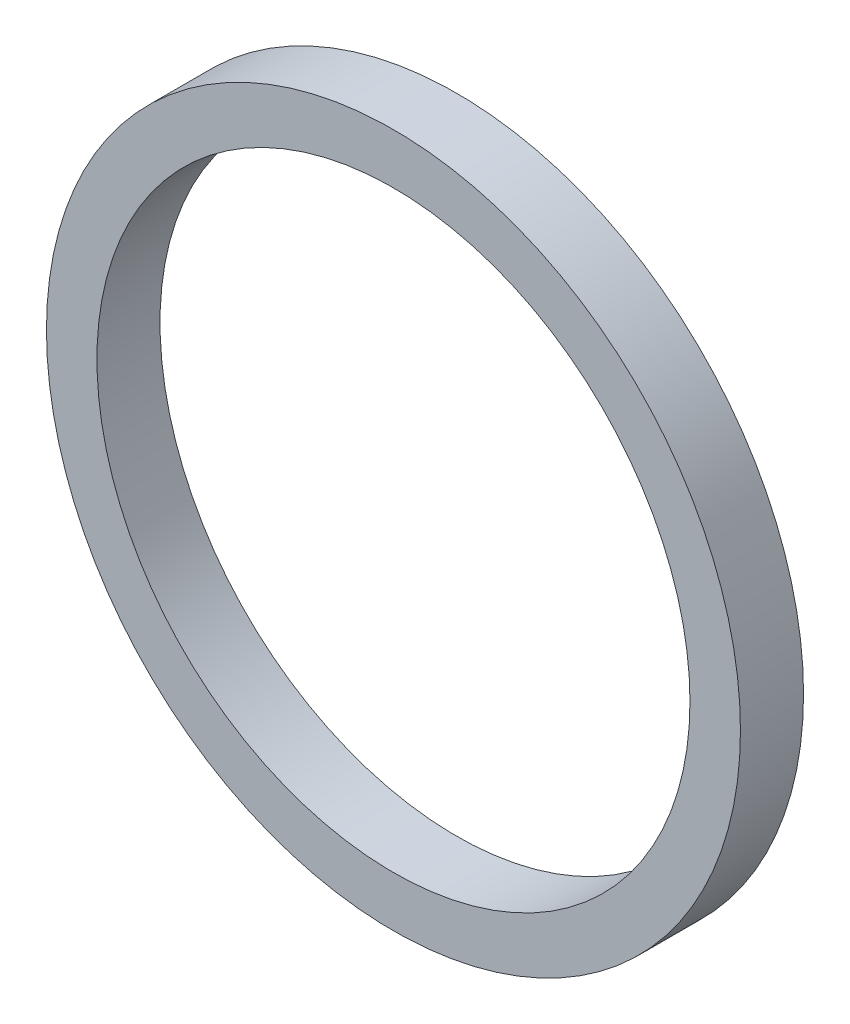
ISO-10303-21;
HEADER;
FILE_DESCRIPTION(('STEP AP214'),'2;1');
FILE_NAME('part.step','',(''),(''),'','','');
FILE_SCHEMA(('AUTOMOTIVE_DESIGN { 1 0 10303 214 1 1 1 1 }'));
ENDSEC;
DATA;
#1=APPLICATION_CONTEXT('core data for automotive mechanical design processes');
#2=APPLICATION_PROTOCOL_DEFINITION('international standard','automotive_design',2000,#1);
#3=PRODUCT_CONTEXT('',#1,'mechanical');
#4=PRODUCT('Part','Part','',(#3));
#5=PRODUCT_RELATED_PRODUCT_CATEGORY('part','',(#4));
#6=PRODUCT_DEFINITION_FORMATION('','',#4);
#7=PRODUCT_DEFINITION_CONTEXT('part definition',#1,'design');
#8=PRODUCT_DEFINITION('design','',#6,#7);
#9=PRODUCT_DEFINITION_SHAPE('','',#8);
#10=(LENGTH_UNIT() NAMED_UNIT(*) SI_UNIT(.MILLI.,.METRE.));
#11=(NAMED_UNIT(*) PLANE_ANGLE_UNIT() SI_UNIT($,.RADIAN.));
#12=(NAMED_UNIT(*) SI_UNIT($,.STERADIAN.) SOLID_ANGLE_UNIT());
#13=UNCERTAINTY_MEASURE_WITH_UNIT(LENGTH_MEASURE(1.E-05),#10,'distance_accuracy_value','');
#14=(GEOMETRIC_REPRESENTATION_CONTEXT(3) GLOBAL_UNCERTAINTY_ASSIGNED_CONTEXT((#13)) GLOBAL_UNIT_ASSIGNED_CONTEXT((#10,
#11,#12)) REPRESENTATION_CONTEXT('',''));
#15=CARTESIAN_POINT('',(0.,0.,0.));
#16=DIRECTION('',(0.,0.,1.));
#17=DIRECTION('',(1.,0.,0.));
#18=AXIS2_PLACEMENT_3D('',#15,#16,#17);
#19=CARTESIAN_POINT('',(0.,0.,3.));
#20=DIRECTION('',(0.,0.,1.));
#21=DIRECTION('',(1.,0.,0.));
#22=AXIS2_PLACEMENT_3D('',#19,#20,#21);
#23=PLANE('',#22);
#24=CARTESIAN_POINT('',(0.,0.,3.));
#25=DIRECTION('',(0.,0.,1.));
#26=DIRECTION('',(1.,0.,0.));
#27=AXIS2_PLACEMENT_3D('',#24,#25,#26);
#28=CIRCLE('',#27,16.5);
#29=CARTESIAN_POINT('',(16.5,0.,3.));
#30=VERTEX_POINT('',#29);
#31=EDGE_CURVE('E10',#30,#30,#28,.T.);
#32=ORIENTED_EDGE('',*,*,#31,.T.);
#33=EDGE_LOOP('',(#32));
#34=FACE_BOUND('',#33,.T.);
#35=CARTESIAN_POINT('',(0.,0.,3.));
#36=DIRECTION('',(0.,0.,1.));
#37=DIRECTION('',(1.,0.,0.));
#38=AXIS2_PLACEMENT_3D('',#35,#36,#37);
#39=CIRCLE('',#38,14.1);
#40=CARTESIAN_POINT('',(14.1,0.,3.));
#41=VERTEX_POINT('',#40);
#42=EDGE_CURVE('E42',#41,#41,#39,.T.);
#43=ORIENTED_EDGE('',*,*,#42,.F.);
#44=EDGE_LOOP('',(#43));
#45=FACE_BOUND('',#44,.T.);
#46=ADVANCED_FACE('F31',(#34,#45),#23,.T.);
#47=CARTESIAN_POINT('',(0.,0.,0.));
#48=DIRECTION('',(0.,0.,1.));
#49=DIRECTION('',(1.,0.,0.));
#50=AXIS2_PLACEMENT_3D('',#47,#48,#49);
#51=PLANE('',#50);
#52=CARTESIAN_POINT('',(0.,0.,0.));
#53=DIRECTION('',(0.,0.,1.));
#54=DIRECTION('',(1.,0.,0.));
#55=AXIS2_PLACEMENT_3D('',#52,#53,#54);
#56=CIRCLE('',#55,16.5);
#57=CARTESIAN_POINT('',(16.5,0.,0.));
#58=VERTEX_POINT('',#57);
#59=EDGE_CURVE('E35',#58,#58,#56,.T.);
#60=ORIENTED_EDGE('',*,*,#59,.F.);
#61=EDGE_LOOP('',(#60));
#62=FACE_BOUND('',#61,.T.);
#63=CARTESIAN_POINT('',(0.,0.,0.));
#64=DIRECTION('',(0.,0.,1.));
#65=DIRECTION('',(1.,0.,0.));
#66=AXIS2_PLACEMENT_3D('',#63,#64,#65);
#67=CIRCLE('',#66,14.1);
#68=CARTESIAN_POINT('',(14.1,0.,0.));
#69=VERTEX_POINT('',#68);
#70=EDGE_CURVE('E44',#69,#69,#67,.T.);
#71=ORIENTED_EDGE('',*,*,#70,.T.);
#72=EDGE_LOOP('',(#71));
#73=FACE_BOUND('',#72,.T.);
#74=ADVANCED_FACE('F54',(#62,#73),#51,.F.);
#75=CARTESIAN_POINT('',(0.,0.,3.));
#76=DIRECTION('',(0.,0.,-1.));
#77=DIRECTION('',(-1.,0.,0.));
#78=AXIS2_PLACEMENT_3D('',#75,#76,#77);
#79=CYLINDRICAL_SURFACE('',#78,16.5);
#80=ORIENTED_EDGE('',*,*,#31,.F.);
#81=EDGE_LOOP('',(#80));
#82=FACE_BOUND('',#81,.T.);
#83=ORIENTED_EDGE('',*,*,#59,.T.);
#84=EDGE_LOOP('',(#83));
#85=FACE_BOUND('',#84,.T.);
#86=ADVANCED_FACE('F33',(#82,#85),#79,.T.);
#87=CARTESIAN_POINT('',(0.,0.,3.));
#88=DIRECTION('',(0.,0.,-1.));
#89=DIRECTION('',(-1.,0.,0.));
#90=AXIS2_PLACEMENT_3D('',#87,#88,#89);
#91=CYLINDRICAL_SURFACE('',#90,14.1);
#92=ORIENTED_EDGE('',*,*,#42,.T.);
#93=EDGE_LOOP('',(#92));
#94=FACE_BOUND('',#93,.T.);
#95=ORIENTED_EDGE('',*,*,#70,.F.);
#96=EDGE_LOOP('',(#95));
#97=FACE_BOUND('',#96,.T.);
#98=ADVANCED_FACE('F50',(#94,#97),#91,.F.);
#99=CLOSED_SHELL('',(#46,#74,#86,#98));
#100=MANIFOLD_SOLID_BREP('B2',#99);
#101=ADVANCED_BREP_SHAPE_REPRESENTATION('',(#18,#100),#14);
#102=SHAPE_DEFINITION_REPRESENTATION(#9,#101);
ENDSEC;
END-ISO-10303-21;
